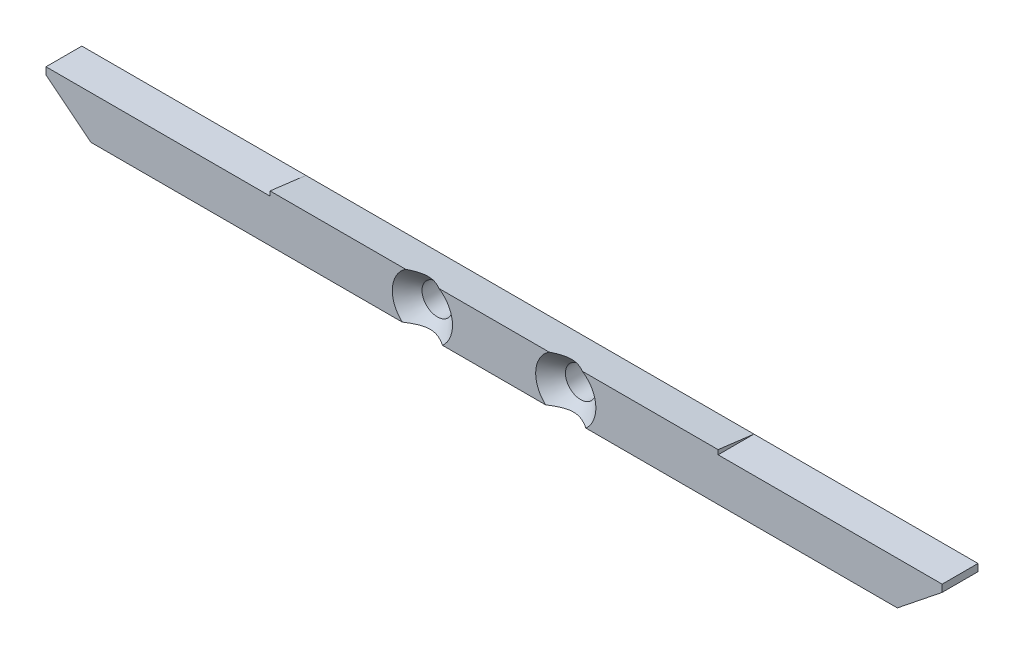
ISO-10303-21;
HEADER;
FILE_DESCRIPTION(('STEP AP214'),'2;1');
FILE_NAME('part.step','',(''),(''),'','','');
FILE_SCHEMA(('AUTOMOTIVE_DESIGN { 1 0 10303 214 1 1 1 1 }'));
ENDSEC;
DATA;
#1=APPLICATION_CONTEXT('core data for automotive mechanical design processes');
#2=APPLICATION_PROTOCOL_DEFINITION('international standard','automotive_design',2000,#1);
#3=PRODUCT_CONTEXT('',#1,'mechanical');
#4=PRODUCT('Part','Part','',(#3));
#5=PRODUCT_RELATED_PRODUCT_CATEGORY('part','',(#4));
#6=PRODUCT_DEFINITION_FORMATION('','',#4);
#7=PRODUCT_DEFINITION_CONTEXT('part definition',#1,'design');
#8=PRODUCT_DEFINITION('design','',#6,#7);
#9=PRODUCT_DEFINITION_SHAPE('','',#8);
#10=(LENGTH_UNIT() NAMED_UNIT(*) SI_UNIT(.MILLI.,.METRE.));
#11=(NAMED_UNIT(*) PLANE_ANGLE_UNIT() SI_UNIT($,.RADIAN.));
#12=(NAMED_UNIT(*) SI_UNIT($,.STERADIAN.) SOLID_ANGLE_UNIT());
#13=UNCERTAINTY_MEASURE_WITH_UNIT(LENGTH_MEASURE(1.E-05),#10,'distance_accuracy_value','');
#14=(GEOMETRIC_REPRESENTATION_CONTEXT(3) GLOBAL_UNCERTAINTY_ASSIGNED_CONTEXT((#13)) GLOBAL_UNIT_ASSIGNED_CONTEXT((#10,
#11,#12)) REPRESENTATION_CONTEXT('',''));
#15=CARTESIAN_POINT('',(0.,0.,0.));
#16=DIRECTION('',(0.,0.,1.));
#17=DIRECTION('',(1.,0.,0.));
#18=AXIS2_PLACEMENT_3D('',#15,#16,#17);
#19=CARTESIAN_POINT('',(0.,4.8,0.));
#20=DIRECTION('',(0.,-0.992277876713668,0.124034734589208));
#21=DIRECTION('',(0.,-0.124034734589208,-0.992277876713668));
#22=AXIS2_PLACEMENT_3D('',#19,#20,#21);
#23=PLANE('',#22);
#24=DIRECTION('',(1.,0.,0.));
#25=VECTOR('',#24,1.);
#26=CARTESIAN_POINT('',(0.,4.8,0.));
#27=LINE('',#26,#25);
#28=CARTESIAN_POINT('',(25.,4.8,0.));
#29=VERTEX_POINT('',#28);
#30=CARTESIAN_POINT('',(75.,4.8,0.));
#31=VERTEX_POINT('',#30);
#32=EDGE_CURVE('E62',#29,#31,#27,.T.);
#33=ORIENTED_EDGE('',*,*,#32,.F.);
#34=DIRECTION('',(0.,-0.124034734589208,-0.992277876713668));
#35=VECTOR('',#34,1.);
#36=CARTESIAN_POINT('',(25.,5.3,4.));
#37=LINE('',#36,#35);
#38=CARTESIAN_POINT('',(25.,5.3,4.));
#39=VERTEX_POINT('',#38);
#40=EDGE_CURVE('E54',#39,#29,#37,.T.);
#41=ORIENTED_EDGE('',*,*,#40,.F.);
#42=DIRECTION('',(-1.,0.,0.));
#43=VECTOR('',#42,1.);
#44=CARTESIAN_POINT('',(0.,5.3,4.));
#45=LINE('',#44,#43);
#46=CARTESIAN_POINT('',(40.142690117401,5.3,4.));
#47=VERTEX_POINT('',#46);
#48=EDGE_CURVE('E153',#47,#39,#45,.T.);
#49=ORIENTED_EDGE('',*,*,#48,.F.);
#50=CARTESIAN_POINT('',(40.1423660103844,5.300025,4.00020000000001));
#51=CARTESIAN_POINT('',(40.2324850911804,5.29308202303116,3.94465618424931));
#52=CARTESIAN_POINT('',(40.3237538022026,5.28634963798703,3.89079710389623));
#53=CARTESIAN_POINT('',(40.5093883813349,5.27345957653499,3.78767661227989));
#54=CARTESIAN_POINT('',(40.6037657785271,5.26730446824696,3.73843574597569));
#55=CARTESIAN_POINT('',(40.7976538941815,5.25566471364756,3.64531770918051));
#56=CARTESIAN_POINT('',(40.8972305897643,5.25019670318609,3.60157362548875));
#57=CARTESIAN_POINT('',(41.0997705957393,5.24036701424602,3.52293611396818));
#58=CARTESIAN_POINT('',(41.2027279310164,5.23600349123032,3.48802792984253));
#59=CARTESIAN_POINT('',(41.3763036778864,5.22993651641221,3.43949213129771));
#60=CARTESIAN_POINT('',(41.446012370964,5.22783308882905,3.42266471063238));
#61=CARTESIAN_POINT('',(41.5865944520669,5.22433242554746,3.39465940437965));
#62=CARTESIAN_POINT('',(41.6574678592965,5.22293520150532,3.38348161204258));
#63=CARTESIAN_POINT('',(41.799246589357,5.22092796095396,3.36742368763167));
#64=CARTESIAN_POINT('',(41.870144892348,5.22031041745849,3.36248333966793));
#65=CARTESIAN_POINT('',(42.0121005080351,5.21987162111771,3.35897296894165));
#66=CARTESIAN_POINT('',(42.0831578129064,5.22005032991206,3.36040263929644));
#67=CARTESIAN_POINT('',(42.2247901907448,5.22119355785538,3.36954846284301));
#68=CARTESIAN_POINT('',(42.2953656477026,5.22215735283345,3.37725882266759));
#69=CARTESIAN_POINT('',(42.4355972139484,5.22481798094261,3.39854384754084));
#70=CARTESIAN_POINT('',(42.5052532240258,5.22651489252313,3.41211914018506));
#71=CARTESIAN_POINT('',(42.7135674731773,5.23262638684489,3.4610110947591));
#72=CARTESIAN_POINT('',(42.8503344766864,5.23804952136439,3.50439617091508));
#73=CARTESIAN_POINT('',(43.0611496003452,5.24812656586356,3.5850125269085));
#74=CARTESIAN_POINT('',(43.1373265512529,5.25214057812713,3.61712462501705));
#75=CARTESIAN_POINT('',(43.2877936446517,5.26069305464613,3.68554443716904));
#76=CARTESIAN_POINT('',(43.36208301624,5.26523172910805,3.72185383286444));
#77=CARTESIAN_POINT('',(43.5074723276236,5.27463697119462,3.79709576955697));
#78=CARTESIAN_POINT('',(43.5786060955994,5.27949560373331,3.83596482986649));
#79=CARTESIAN_POINT('',(43.7192576371857,5.28953558210145,3.91628465681157));
#80=CARTESIAN_POINT('',(43.7887774109215,5.29471649560752,3.95773196486014));
#81=CARTESIAN_POINT('',(43.8576339896156,5.300025,4.00020000000001));
#82=B_SPLINE_CURVE_WITH_KNOTS('',3,(#50,#51,#52,#53,#54,#55,#56,#57,#58,#59,#60,#61,#62,#63,#64,
#65,#66,#67,#68,#69,#70,#71,#72,#73,#74,#75,#76,#77,#78,#79,#80,#81),.UNSPECIFIED.,.F.,.F.,(4,2,
2,2,2,2,2,2,2,2,2,2,2,2,2,4),(0.,0.318368564287935,0.638092212293689,0.964475529263865,
1.29031012257837,1.50533428061375,1.72036198762932,1.9332975496928,2.14622285346141,
2.35895197502729,2.57170386598079,3.0008889804257,3.24910039726991,3.49741160723415,
3.7409718660246,3.98421216706725),.UNSPECIFIED.);
#83=CARTESIAN_POINT('',(43.857309882599,5.3,4.));
#84=VERTEX_POINT('',#83);
#85=EDGE_CURVE('E200',#47,#84,#82,.T.);
#86=ORIENTED_EDGE('',*,*,#85,.T.);
#87=CARTESIAN_POINT('',(56.142690117401,5.3,4.));
#88=VERTEX_POINT('',#87);
#89=EDGE_CURVE('E260',#88,#84,#45,.T.);
#90=ORIENTED_EDGE('',*,*,#89,.F.);
#91=CARTESIAN_POINT('',(56.1423660103844,5.300025,4.00020000000001));
#92=CARTESIAN_POINT('',(56.2324850911804,5.29308202303116,3.9446561842493));
#93=CARTESIAN_POINT('',(56.3237538022025,5.28634963798703,3.89079710389623));
#94=CARTESIAN_POINT('',(56.5093883813349,5.27345957653499,3.78767661227989));
#95=CARTESIAN_POINT('',(56.6037657785271,5.26730446824696,3.73843574597569));
#96=CARTESIAN_POINT('',(56.7976538941815,5.25566471364756,3.64531770918051));
#97=CARTESIAN_POINT('',(56.8972305897642,5.25019670318609,3.60157362548875));
#98=CARTESIAN_POINT('',(57.0997705957393,5.24036701424602,3.52293611396819));
#99=CARTESIAN_POINT('',(57.2027279310164,5.23600349123032,3.48802792984253));
#100=CARTESIAN_POINT('',(57.3763036778863,5.22993651641221,3.43949213129771));
#101=CARTESIAN_POINT('',(57.446012370964,5.22783308882905,3.42266471063238));
#102=CARTESIAN_POINT('',(57.5865944520669,5.22433242554746,3.39465940437964));
#103=CARTESIAN_POINT('',(57.6574678592965,5.22293520150532,3.38348161204258));
#104=CARTESIAN_POINT('',(57.799246589357,5.22092796095396,3.36742368763167));
#105=CARTESIAN_POINT('',(57.870144892348,5.22031041745849,3.36248333966793));
#106=CARTESIAN_POINT('',(58.0121005080351,5.21987162111771,3.35897296894165));
#107=CARTESIAN_POINT('',(58.0831578129064,5.22005032991206,3.36040263929644));
#108=CARTESIAN_POINT('',(58.2247901907448,5.22119355785538,3.36954846284301));
#109=CARTESIAN_POINT('',(58.2953656477026,5.22215735283345,3.37725882266758));
#110=CARTESIAN_POINT('',(58.4355972139484,5.2248179809426,3.39854384754083));
#111=CARTESIAN_POINT('',(58.5052532240258,5.22651489252313,3.41211914018505));
#112=CARTESIAN_POINT('',(58.7135674731773,5.23262638684489,3.4610110947591));
#113=CARTESIAN_POINT('',(58.8503344766864,5.23804952136439,3.50439617091508));
#114=CARTESIAN_POINT('',(59.0611496003451,5.24812656586356,3.5850125269085));
#115=CARTESIAN_POINT('',(59.1373265512529,5.25214057812713,3.61712462501704));
#116=CARTESIAN_POINT('',(59.2877936446517,5.26069305464613,3.68554443716903));
#117=CARTESIAN_POINT('',(59.36208301624,5.26523172910805,3.72185383286443));
#118=CARTESIAN_POINT('',(59.5074723276236,5.27463697119462,3.79709576955696));
#119=CARTESIAN_POINT('',(59.5786060955994,5.27949560373331,3.83596482986649));
#120=CARTESIAN_POINT('',(59.7192576371857,5.28953558210145,3.91628465681157));
#121=CARTESIAN_POINT('',(59.7887774109215,5.29471649560752,3.95773196486014));
#122=CARTESIAN_POINT('',(59.8576339896156,5.300025,4.00020000000001));
#123=B_SPLINE_CURVE_WITH_KNOTS('',3,(#91,#92,#93,#94,#95,#96,#97,#98,#99,#100,#101,#102,#103,
#104,#105,#106,#107,#108,#109,#110,#111,#112,#113,#114,#115,#116,#117,#118,#119,#120,#121,#122),
.UNSPECIFIED.,.F.,.F.,(4,2,2,2,2,2,2,2,2,2,2,2,2,2,2,4),(0.,0.31836856428793,0.638092212293682,
0.964475529263851,1.29031012257835,1.50533428061374,1.72036198762931,1.93329754969279,
2.1462228534614,2.35895197502728,2.57170386598078,3.00088898042568,3.24910039726989,
3.49741160723415,3.7409718660246,3.98421216706725),.UNSPECIFIED.);
#124=CARTESIAN_POINT('',(59.857309882599,5.3,4.));
#125=VERTEX_POINT('',#124);
#126=EDGE_CURVE('E237',#88,#125,#123,.T.);
#127=ORIENTED_EDGE('',*,*,#126,.T.);
#128=CARTESIAN_POINT('',(75.,5.3,4.));
#129=VERTEX_POINT('',#128);
#130=EDGE_CURVE('E258',#129,#125,#45,.T.);
#131=ORIENTED_EDGE('',*,*,#130,.F.);
#132=DIRECTION('',(0.,0.124034734589208,0.992277876713668));
#133=VECTOR('',#132,1.);
#134=CARTESIAN_POINT('',(75.,5.3,4.));
#135=LINE('',#134,#133);
#136=EDGE_CURVE('E163',#31,#129,#135,.T.);
#137=ORIENTED_EDGE('',*,*,#136,.F.);
#138=EDGE_LOOP('',(#33,#41,#49,#86,#90,#127,#131,#137));
#139=FACE_BOUND('',#138,.T.);
#140=ADVANCED_FACE('F35',(#139),#23,.F.);
#141=CARTESIAN_POINT('',(0.,0.,4.));
#142=DIRECTION('',(0.,0.,-1.));
#143=DIRECTION('',(-1.,0.,0.));
#144=AXIS2_PLACEMENT_3D('',#141,#142,#143);
#145=PLANE('',#144);
#146=DIRECTION('',(0.,1.,0.));
#147=VECTOR('',#146,1.);
#148=CARTESIAN_POINT('',(25.,4.8,4.));
#149=LINE('',#148,#147);
#150=CARTESIAN_POINT('',(25.,4.8,4.));
#151=VERTEX_POINT('',#150);
#152=EDGE_CURVE('E145',#151,#39,#149,.T.);
#153=ORIENTED_EDGE('',*,*,#152,.F.);
#154=DIRECTION('',(-1.,0.,0.));
#155=VECTOR('',#154,1.);
#156=CARTESIAN_POINT('',(25.,4.8,4.));
#157=LINE('',#156,#155);
#158=CARTESIAN_POINT('',(0.,4.8,4.));
#159=VERTEX_POINT('',#158);
#160=EDGE_CURVE('E136',#151,#159,#157,.T.);
#161=ORIENTED_EDGE('',*,*,#160,.T.);
#162=DIRECTION('',(0.,-1.,0.));
#163=VECTOR('',#162,1.);
#164=CARTESIAN_POINT('',(0.,0.,4.));
#165=LINE('',#164,#163);
#166=CARTESIAN_POINT('',(0.,4.,4.));
#167=VERTEX_POINT('',#166);
#168=EDGE_CURVE('E248',#159,#167,#165,.T.);
#169=ORIENTED_EDGE('',*,*,#168,.T.);
#170=DIRECTION('',(-0.78086880944303,0.624695047554424,0.));
#171=VECTOR('',#170,1.);
#172=CARTESIAN_POINT('',(0.,4.,4.));
#173=LINE('',#172,#171);
#174=CARTESIAN_POINT('',(5.,0.,4.));
#175=VERTEX_POINT('',#174);
#176=EDGE_CURVE('E179',#175,#167,#173,.T.);
#177=ORIENTED_EDGE('',*,*,#176,.F.);
#178=DIRECTION('',(1.,0.,0.));
#179=VECTOR('',#178,1.);
#180=CARTESIAN_POINT('',(0.,0.,4.));
#181=LINE('',#180,#179);
#182=CARTESIAN_POINT('',(39.7550946567839,0.,4.));
#183=VERTEX_POINT('',#182);
#184=EDGE_CURVE('E252',#175,#183,#181,.T.);
#185=ORIENTED_EDGE('',*,*,#184,.T.);
#186=CARTESIAN_POINT('',(42.,2.5,4.));
#187=DIRECTION('',(0.,0.,1.));
#188=DIRECTION('',(1.,0.,0.));
#189=AXIS2_PLACEMENT_3D('',#186,#187,#188);
#190=CIRCLE('',#189,3.36);
#191=EDGE_CURVE('E193',#47,#183,#190,.T.);
#192=ORIENTED_EDGE('',*,*,#191,.F.);
#193=ORIENTED_EDGE('',*,*,#48,.T.);
#194=EDGE_LOOP('',(#153,#161,#169,#177,#185,#192,#193));
#195=FACE_BOUND('',#194,.T.);
#196=ADVANCED_FACE('F150',(#195),#145,.F.);
#197=CARTESIAN_POINT('',(44.2449053432161,0.,4.));
#198=VERTEX_POINT('',#197);
#199=EDGE_CURVE('E190',#198,#84,#190,.T.);
#200=ORIENTED_EDGE('',*,*,#199,.F.);
#201=CARTESIAN_POINT('',(55.755094656784,0.,4.));
#202=VERTEX_POINT('',#201);
#203=EDGE_CURVE('E255',#198,#202,#181,.T.);
#204=ORIENTED_EDGE('',*,*,#203,.T.);
#205=CARTESIAN_POINT('',(58.,2.5,4.));
#206=DIRECTION('',(0.,0.,1.));
#207=DIRECTION('',(1.,0.,0.));
#208=AXIS2_PLACEMENT_3D('',#205,#206,#207);
#209=CIRCLE('',#208,3.36);
#210=EDGE_CURVE('E442',#88,#202,#209,.T.);
#211=ORIENTED_EDGE('',*,*,#210,.F.);
#212=ORIENTED_EDGE('',*,*,#89,.T.);
#213=EDGE_LOOP('',(#200,#204,#211,#212));
#214=FACE_BOUND('',#213,.T.);
#215=ADVANCED_FACE('F310',(#214),#145,.F.);
#216=DIRECTION('',(0.,1.,0.));
#217=VECTOR('',#216,1.);
#218=CARTESIAN_POINT('',(100.,0.,4.));
#219=LINE('',#218,#217);
#220=CARTESIAN_POINT('',(100.,4.,4.));
#221=VERTEX_POINT('',#220);
#222=CARTESIAN_POINT('',(100.,4.8,4.));
#223=VERTEX_POINT('',#222);
#224=EDGE_CURVE('E254',#221,#223,#219,.T.);
#225=ORIENTED_EDGE('',*,*,#224,.T.);
#226=DIRECTION('',(1.,0.,0.));
#227=VECTOR('',#226,1.);
#228=CARTESIAN_POINT('',(75.,4.8,4.));
#229=LINE('',#228,#227);
#230=CARTESIAN_POINT('',(75.,4.8,4.));
#231=VERTEX_POINT('',#230);
#232=EDGE_CURVE('E165',#231,#223,#229,.T.);
#233=ORIENTED_EDGE('',*,*,#232,.F.);
#234=DIRECTION('',(0.,-1.,0.));
#235=VECTOR('',#234,1.);
#236=CARTESIAN_POINT('',(75.,4.8,4.));
#237=LINE('',#236,#235);
#238=EDGE_CURVE('E158',#129,#231,#237,.T.);
#239=ORIENTED_EDGE('',*,*,#238,.F.);
#240=ORIENTED_EDGE('',*,*,#130,.T.);
#241=CARTESIAN_POINT('',(60.2449053432161,0.,4.));
#242=VERTEX_POINT('',#241);
#243=EDGE_CURVE('E207',#242,#125,#209,.T.);
#244=ORIENTED_EDGE('',*,*,#243,.F.);
#245=CARTESIAN_POINT('',(95.,0.,4.));
#246=VERTEX_POINT('',#245);
#247=EDGE_CURVE('E250',#242,#246,#181,.T.);
#248=ORIENTED_EDGE('',*,*,#247,.T.);
#249=DIRECTION('',(-0.78086880944303,-0.624695047554425,0.));
#250=VECTOR('',#249,1.);
#251=CARTESIAN_POINT('',(100.,4.,4.));
#252=LINE('',#251,#250);
#253=EDGE_CURVE('E169',#221,#246,#252,.T.);
#254=ORIENTED_EDGE('',*,*,#253,.F.);
#255=EDGE_LOOP('',(#225,#233,#239,#240,#244,#248,#254));
#256=FACE_BOUND('',#255,.T.);
#257=ADVANCED_FACE('F285',(#256),#145,.F.);
#258=CARTESIAN_POINT('',(0.,0.,4.));
#259=DIRECTION('',(1.,0.,0.));
#260=DIRECTION('',(0.,0.,-1.));
#261=AXIS2_PLACEMENT_3D('',#258,#259,#260);
#262=PLANE('',#261);
#263=ORIENTED_EDGE('',*,*,#168,.F.);
#264=DIRECTION('',(0.,0.,1.));
#265=VECTOR('',#264,1.);
#266=CARTESIAN_POINT('',(0.,4.8,0.));
#267=LINE('',#266,#265);
#268=CARTESIAN_POINT('',(0.,4.8,0.));
#269=VERTEX_POINT('',#268);
#270=EDGE_CURVE('E140',#269,#159,#267,.T.);
#271=ORIENTED_EDGE('',*,*,#270,.F.);
#272=DIRECTION('',(0.,-1.,0.));
#273=VECTOR('',#272,1.);
#274=CARTESIAN_POINT('',(0.,0.,0.));
#275=LINE('',#274,#273);
#276=CARTESIAN_POINT('',(0.,4.,0.));
#277=VERTEX_POINT('',#276);
#278=EDGE_CURVE('E247',#269,#277,#275,.T.);
#279=ORIENTED_EDGE('',*,*,#278,.T.);
#280=DIRECTION('',(0.,0.,1.));
#281=VECTOR('',#280,1.);
#282=CARTESIAN_POINT('',(0.,4.,0.));
#283=LINE('',#282,#281);
#284=EDGE_CURVE('E187',#277,#167,#283,.T.);
#285=ORIENTED_EDGE('',*,*,#284,.T.);
#286=EDGE_LOOP('',(#263,#271,#279,#285));
#287=FACE_BOUND('',#286,.T.);
#288=ADVANCED_FACE('F37',(#287),#262,.F.);
#289=CARTESIAN_POINT('',(0.,0.,4.));
#290=DIRECTION('',(0.,1.,0.));
#291=DIRECTION('',(0.,0.,1.));
#292=AXIS2_PLACEMENT_3D('',#289,#290,#291);
#293=PLANE('',#292);
#294=DIRECTION('',(1.,0.,0.));
#295=VECTOR('',#294,1.);
#296=CARTESIAN_POINT('',(0.,0.,0.));
#297=LINE('',#296,#295);
#298=CARTESIAN_POINT('',(5.,0.,0.));
#299=VERTEX_POINT('',#298);
#300=CARTESIAN_POINT('',(95.,0.,0.));
#301=VERTEX_POINT('',#300);
#302=EDGE_CURVE('E263',#299,#301,#297,.T.);
#303=ORIENTED_EDGE('',*,*,#302,.T.);
#304=DIRECTION('',(0.,0.,1.));
#305=VECTOR('',#304,1.);
#306=CARTESIAN_POINT('',(95.,0.,0.));
#307=LINE('',#306,#305);
#308=EDGE_CURVE('E176',#301,#246,#307,.T.);
#309=ORIENTED_EDGE('',*,*,#308,.T.);
#310=ORIENTED_EDGE('',*,*,#247,.F.);
#311=CARTESIAN_POINT('',(53.1095941426751,0.,6.13236465007179));
#312=CARTESIAN_POINT('',(53.2225767279804,0.,6.03178052000878));
#313=CARTESIAN_POINT('',(53.3359049039241,0.,5.93158089696772));
#314=CARTESIAN_POINT('',(53.5634359333391,0.,5.73215625210405));
#315=CARTESIAN_POINT('',(53.6776388768702,0.,5.63293133309703));
#316=CARTESIAN_POINT('',(53.907567225299,0.,5.43526341119713));
#317=CARTESIAN_POINT('',(54.0232970390198,0.,5.33682552709668));
#318=CARTESIAN_POINT('',(54.2560314374105,0.,5.14147696706215));
#319=CARTESIAN_POINT('',(54.3730359613878,0.,5.04456621894948));
#320=CARTESIAN_POINT('',(54.615500398122,0.,4.84708900389199));
#321=CARTESIAN_POINT('',(54.7410554428895,0.,4.74663899146112));
#322=CARTESIAN_POINT('',(54.9944136495086,0.,4.54861817784382));
#323=CARTESIAN_POINT('',(55.1222166701626,0.,4.45104719684616));
#324=CARTESIAN_POINT('',(55.3805055219528,0.,4.25997314367807));
#325=CARTESIAN_POINT('',(55.5109864117464,0.,4.16646342460601));
#326=CARTESIAN_POINT('',(55.7756694319821,0.,3.98489838633695));
#327=CARTESIAN_POINT('',(55.9098702340546,0.,3.89684115549075));
#328=CARTESIAN_POINT('',(56.1424054126427,0.,3.75367499047655));
#329=CARTESIAN_POINT('',(56.2395045849948,0.,3.69656988049931));
#330=CARTESIAN_POINT('',(56.4365966693813,0.,3.58745400729232));
#331=CARTESIAN_POINT('',(56.5365904938607,0.,3.5354448735624));
#332=CARTESIAN_POINT('',(56.7390152956502,0.,3.43861547546684));
#333=CARTESIAN_POINT('',(56.8414190155523,0.,3.39373890977025));
#334=CARTESIAN_POINT('',(57.0496687589402,0.,3.31281715643526));
#335=CARTESIAN_POINT('',(57.1555124646676,0.,3.2767661566176));
#336=CARTESIAN_POINT('',(57.3357110529208,0.,3.22580962828512));
#337=CARTESIAN_POINT('',(57.409196614111,0.,3.20783514047001));
#338=CARTESIAN_POINT('',(57.5573815379837,0.,3.17784412026151));
#339=CARTESIAN_POINT('',(57.6320806900963,0.,3.16582656544739));
#340=CARTESIAN_POINT('',(57.782038709295,0.,3.14838201335273));
#341=CARTESIAN_POINT('',(57.8572953618472,0.,3.14293624727558));
#342=CARTESIAN_POINT('',(58.0079967110219,0.,3.13887804612208));
#343=CARTESIAN_POINT('',(58.0834414091559,0.,3.14026566615237));
#344=CARTESIAN_POINT('',(58.2337715726226,0.,3.14978663579495));
#345=CARTESIAN_POINT('',(58.3086577558612,0.,3.15790883876889));
#346=CARTESIAN_POINT('',(58.4574805374939,0.,3.18044740431063));
#347=CARTESIAN_POINT('',(58.5314169039774,0.,3.19486527507422));
#348=CARTESIAN_POINT('',(58.678228989092,0.,3.2293784091974));
#349=CARTESIAN_POINT('',(58.7510996695197,0.,3.24949483254387));
#350=CARTESIAN_POINT('',(58.8952999249292,0.,3.29459403665136));
#351=CARTESIAN_POINT('',(58.9666295034499,0.,3.3195768062369));
#352=CARTESIAN_POINT('',(59.1287020310676,0.,3.38168094109262));
#353=CARTESIAN_POINT('',(59.2189059246737,0.,3.42020223919004));
#354=CARTESIAN_POINT('',(59.3968165345856,0.,3.50266972276869));
#355=CARTESIAN_POINT('',(59.4845219766713,0.,3.5466186174756));
#356=CARTESIAN_POINT('',(59.6578209416962,0.,3.63882962992384));
#357=CARTESIAN_POINT('',(59.7434103701994,0.,3.68709938415842));
#358=CARTESIAN_POINT('',(59.9126225183037,0.,3.78697653409323));
#359=CARTESIAN_POINT('',(59.9962449490223,0.,3.83858441592448));
#360=CARTESIAN_POINT('',(60.1629672301914,0.,3.94518719536532));
#361=CARTESIAN_POINT('',(60.246042922412,0.,4.00021969993808));
#362=CARTESIAN_POINT('',(60.4107153618265,0.,4.11245164566015));
#363=CARTESIAN_POINT('',(60.4923120634171,0.,4.16965115345955));
#364=CARTESIAN_POINT('',(60.6541501411505,0.,4.28572850346676));
#365=CARTESIAN_POINT('',(60.7343930349436,0.,4.34460423557992));
#366=CARTESIAN_POINT('',(60.8938045669697,0.,4.4637825930423));
#367=CARTESIAN_POINT('',(60.9729732449495,0.,4.52408516536972));
#368=CARTESIAN_POINT('',(61.2392041226513,0.,4.73001613607981));
#369=CARTESIAN_POINT('',(61.4241512394477,0.,4.87837846272877));
#370=CARTESIAN_POINT('',(61.7904635527719,0.,5.17947244746721));
#371=CARTESIAN_POINT('',(61.9718282272428,0.,5.33220473455038));
#372=CARTESIAN_POINT('',(62.3320179881398,0.,5.64077530119652));
#373=CARTESIAN_POINT('',(62.5108420116083,0.,5.79661481882446));
#374=CARTESIAN_POINT('',(62.8665489711858,0.,6.11049493137836));
#375=CARTESIAN_POINT('',(63.0434318641743,0.,6.26853557502416));
#376=CARTESIAN_POINT('',(63.3960668912951,0.,6.58657281556067));
#377=CARTESIAN_POINT('',(63.5718160759395,0.,6.74657267807644));
#378=CARTESIAN_POINT('',(63.9221574077419,0.,7.06783701859487));
#379=CARTESIAN_POINT('',(64.096749539765,0.,7.22910151307973));
#380=CARTESIAN_POINT('',(64.6190739374146,0.,7.71427592162689));
#381=CARTESIAN_POINT('',(64.9654457045476,0.,8.0396498604354));
#382=CARTESIAN_POINT('',(65.6150330335349,0.,8.65430976916813));
#383=CARTESIAN_POINT('',(65.9185125491179,0.,8.94331770902412));
#384=CARTESIAN_POINT('',(66.5241520941544,0.,9.52275864842414));
#385=CARTESIAN_POINT('',(66.826312021177,0.,9.81319175500489));
#386=CARTESIAN_POINT('',(67.4286098153497,0.,10.3940946663166));
#387=CARTESIAN_POINT('',(67.7287510641718,0.,10.6845609683964));
#388=CARTESIAN_POINT('',(68.3282392584969,0.,11.2662605142659));
#389=CARTESIAN_POINT('',(68.6275862704248,0.,11.5574936895819));
#390=CARTESIAN_POINT('',(68.9266582195431,0.,11.8490079778145));
#391=B_SPLINE_CURVE_WITH_KNOTS('',3,(#311,#312,#313,#314,#315,#316,#317,#318,#319,#320,#321,
#322,#323,#324,#325,#326,#327,#328,#329,#330,#331,#332,#333,#334,#335,#336,#337,#338,#339,#340,
#341,#342,#343,#344,#345,#346,#347,#348,#349,#350,#351,#352,#353,#354,#355,#356,#357,#358,#359,
#360,#361,#362,#363,#364,#365,#366,#367,#368,#369,#370,#371,#372,#373,#374,#375,#376,#377,#378,
#379,#380,#381,#382,#383,#384,#385,#386,#387,#388,#389,#390),.UNSPECIFIED.,.F.,.F.,(4,2,2,2,2,2,
2,2,2,2,2,2,2,2,2,2,2,2,2,2,2,2,2,2,2,2,2,2,2,2,2,2,2,2,2,2,2,2,2,4),(0.,0.453808990384155,
0.907665347076911,1.36345154225588,1.81921613013578,2.3015633536554,2.78388038792181,
3.26537574846373,3.74670132895609,4.08452829548979,4.42246293612783,4.75758114303718,
5.09247805663566,5.3192246684038,5.5459323489341,5.77199101628344,5.9980515066462,
6.22373858171184,6.44947975226143,6.67607039161984,6.90266051062347,7.19667515732271,
7.49083716136457,7.78552972511353,8.08026530194199,8.37917349103517,8.67809088106387,
8.97664731094399,9.27519266375078,9.98637551852307,10.6976612580877,11.4092363063089,
12.1208271296811,12.8338335548876,13.5468492883459,14.9725099701012,16.22973613518,
17.4870582149403,18.7400926237263,19.993018706508),.UNSPECIFIED.);
#392=EDGE_CURVE('E47',#242,#202,#391,.F.);
#393=ORIENTED_EDGE('',*,*,#392,.T.);
#394=ORIENTED_EDGE('',*,*,#203,.F.);
#395=CARTESIAN_POINT('',(37.1095941521044,0.,6.13236464167593));
#396=CARTESIAN_POINT('',(37.2225767370823,0.,6.03178051194459));
#397=CARTESIAN_POINT('',(37.3359049126981,0.,5.93158088923494));
#398=CARTESIAN_POINT('',(37.563435941456,0.,5.73215624503301));
#399=CARTESIAN_POINT('',(37.677638884658,0.,5.63293132635632));
#400=CARTESIAN_POINT('',(37.9075672324241,0.,5.43526340511745));
#401=CARTESIAN_POINT('',(38.0232970458115,0.,5.33682552134769));
#402=CARTESIAN_POINT('',(38.2560314435327,0.,5.14147696197178));
#403=CARTESIAN_POINT('',(38.3730359671737,0.,5.04456621418704));
#404=CARTESIAN_POINT('',(38.6155004032926,0.,4.84708899973383));
#405=CARTESIAN_POINT('',(38.741055447782,0.,4.74663898758049));
#406=CARTESIAN_POINT('',(38.9944136538408,0.,4.54861817451458));
#407=CARTESIAN_POINT('',(39.1222166742127,0.,4.45104719379081));
#408=CARTESIAN_POINT('',(39.3805055254326,0.,4.25997314116304));
#409=CARTESIAN_POINT('',(39.5109864149382,0.,4.16646342235745));
#410=CARTESIAN_POINT('',(39.7756694345872,0.,3.9848983846092));
#411=CARTESIAN_POINT('',(39.9098702363609,0.,3.89684115401735));
#412=CARTESIAN_POINT('',(40.1424054150756,0.,3.75367498901601));
#413=CARTESIAN_POINT('',(40.2395045878737,0.,3.69656987882951));
#414=CARTESIAN_POINT('',(40.4365966731826,0.,3.5874540052639));
#415=CARTESIAN_POINT('',(40.5365904981386,0.,3.53544487138466));
#416=CARTESIAN_POINT('',(40.7390153008894,0.,3.43861547309096));
#417=CARTESIAN_POINT('',(40.8414190212751,0.,3.39373890734331));
#418=CARTESIAN_POINT('',(41.0496687656595,0.,3.31281715402685));
#419=CARTESIAN_POINT('',(41.1555124718998,0.,3.27676615427854));
#420=CARTESIAN_POINT('',(41.335711060751,0.,3.22580962626988));
#421=CARTESIAN_POINT('',(41.4091966220174,0.,3.20783513864766));
#422=CARTESIAN_POINT('',(41.5573815460306,0.,3.17784411885482));
#423=CARTESIAN_POINT('',(41.6320806982074,0.,3.16582656426347));
#424=CARTESIAN_POINT('',(41.7820387175194,0.,3.14838201263551));
#425=CARTESIAN_POINT('',(41.8572953701207,0.,3.14293624680255));
#426=CARTESIAN_POINT('',(42.007996719371,0.,3.13887804614743));
#427=CARTESIAN_POINT('',(42.0834414175316,0.,3.14026566643193));
#428=CARTESIAN_POINT('',(42.2337715810098,0.,3.14978663657672));
#429=CARTESIAN_POINT('',(42.3086577642335,0.,3.15790883979697));
#430=CARTESIAN_POINT('',(42.4574805458192,0.,3.18044740581158));
#431=CARTESIAN_POINT('',(42.5314169122706,0.,3.19486527680173));
#432=CARTESIAN_POINT('',(42.6782289973106,0.,3.22937841135255));
#433=CARTESIAN_POINT('',(42.7510996776958,0.,3.24949483490005));
#434=CARTESIAN_POINT('',(42.8952999330153,0.,3.29459403938131));
#435=CARTESIAN_POINT('',(42.9666295114884,0.,3.31957680913959));
#436=CARTESIAN_POINT('',(43.1287020398845,0.,3.38168094470176));
#437=CARTESIAN_POINT('',(43.218905934291,0.,3.4202022433907));
#438=CARTESIAN_POINT('',(43.3968165457627,0.,3.50266972820715));
#439=CARTESIAN_POINT('',(43.4845219886079,0.,3.5466186235604));
#440=CARTESIAN_POINT('',(43.6578209551245,0.,3.63882963733593));
#441=CARTESIAN_POINT('',(43.7434103843598,0.,3.68709939225161));
#442=CARTESIAN_POINT('',(43.9126225339066,0.,3.78697654356772));
#443=CARTESIAN_POINT('',(43.9962449653356,0.,3.83858442609915));
#444=CARTESIAN_POINT('',(44.1629672479188,0.,3.94518720695996));
#445=CARTESIAN_POINT('',(44.2460429408428,0.,4.00021971225259));
#446=CARTESIAN_POINT('',(44.4107153816539,0.,4.11245165942023));
#447=CARTESIAN_POINT('',(44.4923120839375,0.,4.16965116794533));
#448=CARTESIAN_POINT('',(44.654150163048,0.,4.28572851940478));
#449=CARTESIAN_POINT('',(44.7343930575251,0.,4.34460425224448));
#450=CARTESIAN_POINT('',(44.8938045909147,0.,4.46378261116079));
#451=CARTESIAN_POINT('',(44.9729732695739,0.,4.5240851842156));
#452=CARTESIAN_POINT('',(45.2392041498999,0.,4.73001615764114));
#453=CARTESIAN_POINT('',(45.4241512686255,0.,4.87837848628902));
#454=CARTESIAN_POINT('',(45.7904635857942,0.,5.17947247502991));
#455=CARTESIAN_POINT('',(45.9718282621804,0.,5.3322047641166));
#456=CARTESIAN_POINT('',(46.3320180269026,0.,5.64077533476846));
#457=CARTESIAN_POINT('',(46.510842052281,0.,5.79661485439859));
#458=CARTESIAN_POINT('',(46.8665490156774,0.,6.11049497095336));
#459=CARTESIAN_POINT('',(47.0434319105749,0.,6.26853561659784));
#460=CARTESIAN_POINT('',(47.396066941515,0.,6.5865728611282));
#461=CARTESIAN_POINT('',(47.5718161280696,0.,6.7465727256391));
#462=CARTESIAN_POINT('',(47.9221574636948,0.,7.06783707014363));
#463=CARTESIAN_POINT('',(48.0967495976303,0.,7.22910156661947));
#464=CARTESIAN_POINT('',(48.6190740010212,0.,7.71427598113397));
#465=CARTESIAN_POINT('',(48.9654457719866,0.,8.03964992391304));
#466=CARTESIAN_POINT('',(49.6150331082877,0.,8.65430984019352));
#467=CARTESIAN_POINT('',(49.9185126273503,0.,8.94331778362869));
#468=CARTESIAN_POINT('',(50.5241521793517,0.,9.52275873017983));
#469=CARTESIAN_POINT('',(50.8263121098596,0.,9.81319184033252));
#470=CARTESIAN_POINT('',(51.4286099110121,0.,10.3940947587853));
#471=CARTESIAN_POINT('',(51.7287511633286,0.,10.6845610644344));
#472=CARTESIAN_POINT('',(52.3282393646467,0.,11.2662606174378));
#473=CARTESIAN_POINT('',(52.6275863800734,0.,11.5574937963183));
#474=CARTESIAN_POINT('',(52.9266583326923,0.,11.8490080881135));
#475=B_SPLINE_CURVE_WITH_KNOTS('',3,(#395,#396,#397,#398,#399,#400,#401,#402,#403,#404,#405,
#406,#407,#408,#409,#410,#411,#412,#413,#414,#415,#416,#417,#418,#419,#420,#421,#422,#423,#424,
#425,#426,#427,#428,#429,#430,#431,#432,#433,#434,#435,#436,#437,#438,#439,#440,#441,#442,#443,
#444,#445,#446,#447,#448,#449,#450,#451,#452,#453,#454,#455,#456,#457,#458,#459,#460,#461,#462,
#463,#464,#465,#466,#467,#468,#469,#470,#471,#472,#473,#474),.UNSPECIFIED.,.F.,.F.,(4,2,2,2,2,2,
2,2,2,2,2,2,2,2,2,2,2,2,2,2,2,2,2,2,2,2,2,2,2,2,2,2,2,2,2,2,2,2,2,4),(0.,0.453808988988803,
0.907665344285999,1.3634515380604,1.81921612453588,2.30156334688397,2.78388037997893,
3.26537573935295,3.74670131867845,4.08452828668144,4.42246292879088,4.75758113708423,
5.09247805205977,5.31922466391053,5.54593234452308,5.77199101196516,5.99805150242141,
6.22373857752352,6.44947974811031,6.67607038750809,6.90266050655009,7.19667515615018,
7.49083716309654,7.78552972976164,8.08026530950685,8.37917350155208,8.67809089453309,
8.97664732735716,9.27519268310783,9.98637554614755,10.6976612939794,11.4092363504667,
12.1208271821048,12.8338336155786,13.5468493573041,14.9725100555954,16.2297362356386,
17.4870583303632,18.7400927541288,19.9930188518906),.UNSPECIFIED.);
#476=EDGE_CURVE('E11',#198,#183,#475,.F.);
#477=ORIENTED_EDGE('',*,*,#476,.T.);
#478=ORIENTED_EDGE('',*,*,#184,.F.);
#479=DIRECTION('',(0.,0.,1.));
#480=VECTOR('',#479,1.);
#481=CARTESIAN_POINT('',(5.,0.,0.));
#482=LINE('',#481,#480);
#483=EDGE_CURVE('E184',#299,#175,#482,.T.);
#484=ORIENTED_EDGE('',*,*,#483,.F.);
#485=EDGE_LOOP('',(#303,#309,#310,#393,#394,#477,#478,#484));
#486=FACE_BOUND('',#485,.T.);
#487=ADVANCED_FACE('F294',(#486),#293,.F.);
#488=CARTESIAN_POINT('',(100.,0.,4.));
#489=DIRECTION('',(-1.,0.,0.));
#490=DIRECTION('',(0.,0.,1.));
#491=AXIS2_PLACEMENT_3D('',#488,#489,#490);
#492=PLANE('',#491);
#493=DIRECTION('',(0.,1.,0.));
#494=VECTOR('',#493,1.);
#495=CARTESIAN_POINT('',(100.,0.,0.));
#496=LINE('',#495,#494);
#497=CARTESIAN_POINT('',(100.,4.,0.));
#498=VERTEX_POINT('',#497);
#499=CARTESIAN_POINT('',(100.,4.8,0.));
#500=VERTEX_POINT('',#499);
#501=EDGE_CURVE('E251',#498,#500,#496,.T.);
#502=ORIENTED_EDGE('',*,*,#501,.T.);
#503=DIRECTION('',(0.,0.,-1.));
#504=VECTOR('',#503,1.);
#505=CARTESIAN_POINT('',(100.,4.8,0.));
#506=LINE('',#505,#504);
#507=EDGE_CURVE('E144',#223,#500,#506,.T.);
#508=ORIENTED_EDGE('',*,*,#507,.F.);
#509=ORIENTED_EDGE('',*,*,#224,.F.);
#510=DIRECTION('',(0.,0.,1.));
#511=VECTOR('',#510,1.);
#512=CARTESIAN_POINT('',(100.,4.,0.));
#513=LINE('',#512,#511);
#514=EDGE_CURVE('E174',#498,#221,#513,.T.);
#515=ORIENTED_EDGE('',*,*,#514,.F.);
#516=EDGE_LOOP('',(#502,#508,#509,#515));
#517=FACE_BOUND('',#516,.T.);
#518=ADVANCED_FACE('F270',(#517),#492,.F.);
#519=CARTESIAN_POINT('',(0.,0.,0.));
#520=DIRECTION('',(0.,0.,-1.));
#521=DIRECTION('',(-1.,0.,0.));
#522=AXIS2_PLACEMENT_3D('',#519,#520,#521);
#523=PLANE('',#522);
#524=DIRECTION('',(-0.78086880944303,-0.624695047554425,0.));
#525=VECTOR('',#524,1.);
#526=CARTESIAN_POINT('',(100.,4.,0.));
#527=LINE('',#526,#525);
#528=EDGE_CURVE('E171',#498,#301,#527,.T.);
#529=ORIENTED_EDGE('',*,*,#528,.T.);
#530=ORIENTED_EDGE('',*,*,#302,.F.);
#531=DIRECTION('',(-0.78086880944303,0.624695047554424,0.));
#532=VECTOR('',#531,1.);
#533=CARTESIAN_POINT('',(0.,4.,0.));
#534=LINE('',#533,#532);
#535=EDGE_CURVE('E181',#299,#277,#534,.T.);
#536=ORIENTED_EDGE('',*,*,#535,.T.);
#537=ORIENTED_EDGE('',*,*,#278,.F.);
#538=EDGE_CURVE('E245',#269,#29,#27,.T.);
#539=ORIENTED_EDGE('',*,*,#538,.T.);
#540=ORIENTED_EDGE('',*,*,#32,.T.);
#541=DIRECTION('',(1.,0.,0.));
#542=VECTOR('',#541,1.);
#543=CARTESIAN_POINT('',(75.,4.8,0.));
#544=LINE('',#543,#542);
#545=EDGE_CURVE('E167',#31,#500,#544,.T.);
#546=ORIENTED_EDGE('',*,*,#545,.T.);
#547=ORIENTED_EDGE('',*,*,#501,.F.);
#548=EDGE_LOOP('',(#529,#530,#536,#537,#539,#540,#546,#547));
#549=FACE_BOUND('',#548,.T.);
#550=CARTESIAN_POINT('',(42.,2.5,0.));
#551=DIRECTION('',(0.,0.,1.));
#552=DIRECTION('',(1.,0.,0.));
#553=AXIS2_PLACEMENT_3D('',#550,#551,#552);
#554=CIRCLE('',#553,1.7);
#555=CARTESIAN_POINT('',(43.7,2.5,0.));
#556=VERTEX_POINT('',#555);
#557=EDGE_CURVE('E197',#556,#556,#554,.T.);
#558=ORIENTED_EDGE('',*,*,#557,.T.);
#559=EDGE_LOOP('',(#558));
#560=FACE_BOUND('',#559,.T.);
#561=CARTESIAN_POINT('',(58.,2.5,0.));
#562=DIRECTION('',(0.,0.,1.));
#563=DIRECTION('',(1.,0.,0.));
#564=AXIS2_PLACEMENT_3D('',#561,#562,#563);
#565=CIRCLE('',#564,1.7);
#566=CARTESIAN_POINT('',(59.7,2.5,0.));
#567=VERTEX_POINT('',#566);
#568=EDGE_CURVE('E244',#567,#567,#565,.T.);
#569=ORIENTED_EDGE('',*,*,#568,.T.);
#570=EDGE_LOOP('',(#569));
#571=FACE_BOUND('',#570,.T.);
#572=ADVANCED_FACE('F229',(#549,#560,#571),#523,.T.);
#573=CARTESIAN_POINT('',(58.,2.5,4.));
#574=DIRECTION('',(0.,0.,1.));
#575=DIRECTION('',(1.,0.,0.));
#576=AXIS2_PLACEMENT_3D('',#573,#574,#575);
#577=CONICAL_SURFACE('',#576,3.36,0.785398163397448);
#578=CARTESIAN_POINT('',(58.,2.5,2.34));
#579=DIRECTION('',(0.,0.,1.));
#580=DIRECTION('',(1.,0.,0.));
#581=AXIS2_PLACEMENT_3D('',#578,#579,#580);
#582=CIRCLE('',#581,1.7);
#583=CARTESIAN_POINT('',(59.7,2.5,2.34));
#584=VERTEX_POINT('',#583);
#585=EDGE_CURVE('E441',#584,#584,#582,.T.);
#586=ORIENTED_EDGE('',*,*,#585,.F.);
#587=EDGE_LOOP('',(#586));
#588=FACE_BOUND('',#587,.T.);
#589=ORIENTED_EDGE('',*,*,#210,.T.);
#590=ORIENTED_EDGE('',*,*,#392,.F.);
#591=ORIENTED_EDGE('',*,*,#243,.T.);
#592=ORIENTED_EDGE('',*,*,#126,.F.);
#593=EDGE_LOOP('',(#589,#590,#591,#592));
#594=FACE_BOUND('',#593,.T.);
#595=ADVANCED_FACE('F226',(#588,#594),#577,.F.);
#596=CARTESIAN_POINT('',(58.,2.5,4.));
#597=DIRECTION('',(0.,0.,1.));
#598=DIRECTION('',(1.,0.,0.));
#599=AXIS2_PLACEMENT_3D('',#596,#597,#598);
#600=CYLINDRICAL_SURFACE('',#599,1.7);
#601=ORIENTED_EDGE('',*,*,#568,.F.);
#602=EDGE_LOOP('',(#601));
#603=FACE_BOUND('',#602,.T.);
#604=ORIENTED_EDGE('',*,*,#585,.T.);
#605=EDGE_LOOP('',(#604));
#606=FACE_BOUND('',#605,.T.);
#607=ADVANCED_FACE('F218',(#603,#606),#600,.F.);
#608=CARTESIAN_POINT('',(42.,2.5,4.));
#609=DIRECTION('',(0.,0.,1.));
#610=DIRECTION('',(1.,0.,0.));
#611=AXIS2_PLACEMENT_3D('',#608,#609,#610);
#612=CONICAL_SURFACE('',#611,3.36,0.785398163397448);
#613=CARTESIAN_POINT('',(42.,2.5,2.34));
#614=DIRECTION('',(0.,0.,1.));
#615=DIRECTION('',(1.,0.,0.));
#616=AXIS2_PLACEMENT_3D('',#613,#614,#615);
#617=CIRCLE('',#616,1.7);
#618=CARTESIAN_POINT('',(43.7,2.5,2.34));
#619=VERTEX_POINT('',#618);
#620=EDGE_CURVE('E194',#619,#619,#617,.T.);
#621=ORIENTED_EDGE('',*,*,#620,.F.);
#622=EDGE_LOOP('',(#621));
#623=FACE_BOUND('',#622,.T.);
#624=ORIENTED_EDGE('',*,*,#191,.T.);
#625=ORIENTED_EDGE('',*,*,#476,.F.);
#626=ORIENTED_EDGE('',*,*,#199,.T.);
#627=ORIENTED_EDGE('',*,*,#85,.F.);
#628=EDGE_LOOP('',(#624,#625,#626,#627));
#629=FACE_BOUND('',#628,.T.);
#630=ADVANCED_FACE('F212',(#623,#629),#612,.F.);
#631=CARTESIAN_POINT('',(42.,2.5,4.));
#632=DIRECTION('',(0.,0.,1.));
#633=DIRECTION('',(1.,0.,0.));
#634=AXIS2_PLACEMENT_3D('',#631,#632,#633);
#635=CYLINDRICAL_SURFACE('',#634,1.7);
#636=ORIENTED_EDGE('',*,*,#557,.F.);
#637=EDGE_LOOP('',(#636));
#638=FACE_BOUND('',#637,.T.);
#639=ORIENTED_EDGE('',*,*,#620,.T.);
#640=EDGE_LOOP('',(#639));
#641=FACE_BOUND('',#640,.T.);
#642=ADVANCED_FACE('F217',(#638,#641),#635,.F.);
#643=CARTESIAN_POINT('',(0.,4.,0.));
#644=DIRECTION('',(0.624695047554424,0.78086880944303,0.));
#645=DIRECTION('',(-0.78086880944303,0.624695047554424,0.));
#646=AXIS2_PLACEMENT_3D('',#643,#644,#645);
#647=PLANE('',#646);
#648=ORIENTED_EDGE('',*,*,#176,.T.);
#649=ORIENTED_EDGE('',*,*,#284,.F.);
#650=ORIENTED_EDGE('',*,*,#535,.F.);
#651=ORIENTED_EDGE('',*,*,#483,.T.);
#652=EDGE_LOOP('',(#648,#649,#650,#651));
#653=FACE_BOUND('',#652,.T.);
#654=ADVANCED_FACE('F220',(#653),#647,.F.);
#655=CARTESIAN_POINT('',(100.,4.,0.));
#656=DIRECTION('',(-0.624695047554425,0.78086880944303,0.));
#657=DIRECTION('',(-0.78086880944303,-0.624695047554425,0.));
#658=AXIS2_PLACEMENT_3D('',#655,#656,#657);
#659=PLANE('',#658);
#660=ORIENTED_EDGE('',*,*,#253,.T.);
#661=ORIENTED_EDGE('',*,*,#308,.F.);
#662=ORIENTED_EDGE('',*,*,#528,.F.);
#663=ORIENTED_EDGE('',*,*,#514,.T.);
#664=EDGE_LOOP('',(#660,#661,#662,#663));
#665=FACE_BOUND('',#664,.T.);
#666=ADVANCED_FACE('F292',(#665),#659,.F.);
#667=CARTESIAN_POINT('',(75.,4.8,0.));
#668=DIRECTION('',(0.,-1.,0.));
#669=DIRECTION('',(0.,0.,-1.));
#670=AXIS2_PLACEMENT_3D('',#667,#668,#669);
#671=PLANE('',#670);
#672=ORIENTED_EDGE('',*,*,#507,.T.);
#673=ORIENTED_EDGE('',*,*,#545,.F.);
#674=DIRECTION('',(0.,0.,-1.));
#675=VECTOR('',#674,1.);
#676=CARTESIAN_POINT('',(75.,4.8,0.));
#677=LINE('',#676,#675);
#678=EDGE_CURVE('E161',#231,#31,#677,.T.);
#679=ORIENTED_EDGE('',*,*,#678,.F.);
#680=ORIENTED_EDGE('',*,*,#232,.T.);
#681=EDGE_LOOP('',(#672,#673,#679,#680));
#682=FACE_BOUND('',#681,.T.);
#683=ADVANCED_FACE('F277',(#682),#671,.F.);
#684=CARTESIAN_POINT('',(75.,0.,0.));
#685=DIRECTION('',(1.,0.,0.));
#686=DIRECTION('',(0.,0.,-1.));
#687=AXIS2_PLACEMENT_3D('',#684,#685,#686);
#688=PLANE('',#687);
#689=ORIENTED_EDGE('',*,*,#238,.T.);
#690=ORIENTED_EDGE('',*,*,#678,.T.);
#691=ORIENTED_EDGE('',*,*,#136,.T.);
#692=EDGE_LOOP('',(#689,#690,#691));
#693=FACE_BOUND('',#692,.T.);
#694=ADVANCED_FACE('F282',(#693),#688,.T.);
#695=CARTESIAN_POINT('',(25.,4.8,0.));
#696=DIRECTION('',(0.,-1.,0.));
#697=DIRECTION('',(0.,0.,-1.));
#698=AXIS2_PLACEMENT_3D('',#695,#696,#697);
#699=PLANE('',#698);
#700=ORIENTED_EDGE('',*,*,#270,.T.);
#701=ORIENTED_EDGE('',*,*,#160,.F.);
#702=DIRECTION('',(0.,0.,1.));
#703=VECTOR('',#702,1.);
#704=CARTESIAN_POINT('',(25.,4.8,0.));
#705=LINE('',#704,#703);
#706=EDGE_CURVE('E138',#29,#151,#705,.T.);
#707=ORIENTED_EDGE('',*,*,#706,.F.);
#708=ORIENTED_EDGE('',*,*,#538,.F.);
#709=EDGE_LOOP('',(#700,#701,#707,#708));
#710=FACE_BOUND('',#709,.T.);
#711=ADVANCED_FACE('F137',(#710),#699,.F.);
#712=CARTESIAN_POINT('',(25.,0.,0.));
#713=DIRECTION('',(1.,0.,0.));
#714=DIRECTION('',(0.,0.,-1.));
#715=AXIS2_PLACEMENT_3D('',#712,#713,#714);
#716=PLANE('',#715);
#717=ORIENTED_EDGE('',*,*,#40,.T.);
#718=ORIENTED_EDGE('',*,*,#706,.T.);
#719=ORIENTED_EDGE('',*,*,#152,.T.);
#720=EDGE_LOOP('',(#717,#718,#719));
#721=FACE_BOUND('',#720,.T.);
#722=ADVANCED_FACE('F147',(#721),#716,.F.);
#723=CLOSED_SHELL('',(#140,#196,#215,#257,#288,#487,#518,#572,#595,#607,#630,#642,#654,#666,
#683,#694,#711,#722));
#724=MANIFOLD_SOLID_BREP('B2',#723);
#725=ADVANCED_BREP_SHAPE_REPRESENTATION('',(#18,#724),#14);
#726=SHAPE_DEFINITION_REPRESENTATION(#9,#725);
ENDSEC;
END-ISO-10303-21;
